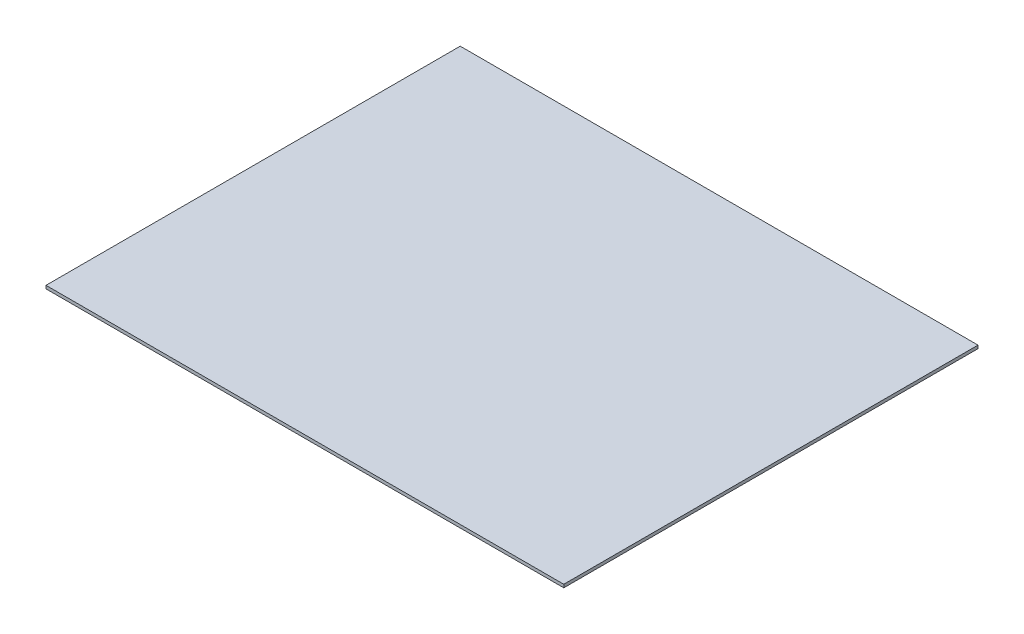
ISO-10303-21;
HEADER;
FILE_DESCRIPTION(('STEP AP214'),'2;1');
FILE_NAME('part.step','',(''),(''),'','','');
FILE_SCHEMA(('AUTOMOTIVE_DESIGN { 1 0 10303 214 1 1 1 1 }'));
ENDSEC;
DATA;
#1=APPLICATION_CONTEXT('core data for automotive mechanical design processes');
#2=APPLICATION_PROTOCOL_DEFINITION('international standard','automotive_design',2000,#1);
#3=PRODUCT_CONTEXT('',#1,'mechanical');
#4=PRODUCT('Part','Part','',(#3));
#5=PRODUCT_RELATED_PRODUCT_CATEGORY('part','',(#4));
#6=PRODUCT_DEFINITION_FORMATION('','',#4);
#7=PRODUCT_DEFINITION_CONTEXT('part definition',#1,'design');
#8=PRODUCT_DEFINITION('design','',#6,#7);
#9=PRODUCT_DEFINITION_SHAPE('','',#8);
#10=(LENGTH_UNIT() NAMED_UNIT(*) SI_UNIT(.MILLI.,.METRE.));
#11=(NAMED_UNIT(*) PLANE_ANGLE_UNIT() SI_UNIT($,.RADIAN.));
#12=(NAMED_UNIT(*) SI_UNIT($,.STERADIAN.) SOLID_ANGLE_UNIT());
#13=UNCERTAINTY_MEASURE_WITH_UNIT(LENGTH_MEASURE(1.E-05),#10,'distance_accuracy_value','');
#14=(GEOMETRIC_REPRESENTATION_CONTEXT(3) GLOBAL_UNCERTAINTY_ASSIGNED_CONTEXT((#13)) GLOBAL_UNIT_ASSIGNED_CONTEXT((#10,
#11,#12)) REPRESENTATION_CONTEXT('',''));
#15=CARTESIAN_POINT('',(0.,0.,0.));
#16=DIRECTION('',(0.,0.,1.));
#17=DIRECTION('',(1.,0.,0.));
#18=AXIS2_PLACEMENT_3D('',#15,#16,#17);
#19=CARTESIAN_POINT('',(-63.4999999999999,-196.85,-558.8));
#20=DIRECTION('',(0.,0.,1.));
#21=DIRECTION('',(1.,0.,0.));
#22=AXIS2_PLACEMENT_3D('',#19,#20,#21);
#23=PLANE('',#22);
#24=DIRECTION('',(0.,1.,0.));
#25=VECTOR('',#24,1.);
#26=CARTESIAN_POINT('',(63.5000000000001,-196.85,-558.8));
#27=LINE('',#26,#25);
#28=CARTESIAN_POINT('',(63.5000000000001,-196.85,-558.8));
#29=VERTEX_POINT('',#28);
#30=CARTESIAN_POINT('',(63.5000000000001,-196.088,-558.8));
#31=VERTEX_POINT('',#30);
#32=EDGE_CURVE('E93',#29,#31,#27,.T.);
#33=ORIENTED_EDGE('',*,*,#32,.F.);
#34=DIRECTION('',(-1.,0.,0.));
#35=VECTOR('',#34,1.);
#36=CARTESIAN_POINT('',(-69.85,-196.85,-558.8));
#37=LINE('',#36,#35);
#38=CARTESIAN_POINT('',(-63.4999999999999,-196.85,-558.8));
#39=VERTEX_POINT('',#38);
#40=EDGE_CURVE('E98',#29,#39,#37,.T.);
#41=ORIENTED_EDGE('',*,*,#40,.T.);
#42=DIRECTION('',(0.,1.,0.));
#43=VECTOR('',#42,1.);
#44=CARTESIAN_POINT('',(-63.4999999999999,-196.85,-558.8));
#45=LINE('',#44,#43);
#46=CARTESIAN_POINT('',(-63.4999999999999,-196.088,-558.8));
#47=VERTEX_POINT('',#46);
#48=EDGE_CURVE('E92',#39,#47,#45,.T.);
#49=ORIENTED_EDGE('',*,*,#48,.T.);
#50=DIRECTION('',(-1.,0.,0.));
#51=VECTOR('',#50,1.);
#52=CARTESIAN_POINT('',(-69.85,-196.088,-558.8));
#53=LINE('',#52,#51);
#54=EDGE_CURVE('E11',#31,#47,#53,.T.);
#55=ORIENTED_EDGE('',*,*,#54,.F.);
#56=EDGE_LOOP('',(#33,#41,#49,#55));
#57=FACE_BOUND('',#56,.T.);
#58=ADVANCED_FACE('F34',(#57),#23,.F.);
#59=CARTESIAN_POINT('',(63.5000000000001,-196.85,-457.2));
#60=DIRECTION('',(-1.,0.,0.));
#61=DIRECTION('',(0.,0.,1.));
#62=AXIS2_PLACEMENT_3D('',#59,#60,#61);
#63=PLANE('',#62);
#64=DIRECTION('',(0.,1.,0.));
#65=VECTOR('',#64,1.);
#66=CARTESIAN_POINT('',(63.5000000000001,-196.85,-457.2));
#67=LINE('',#66,#65);
#68=CARTESIAN_POINT('',(63.5000000000001,-196.85,-457.2));
#69=VERTEX_POINT('',#68);
#70=CARTESIAN_POINT('',(63.5000000000001,-196.088,-457.2));
#71=VERTEX_POINT('',#70);
#72=EDGE_CURVE('E38',#69,#71,#67,.T.);
#73=ORIENTED_EDGE('',*,*,#72,.F.);
#74=DIRECTION('',(0.,0.,-1.));
#75=VECTOR('',#74,1.);
#76=CARTESIAN_POINT('',(63.5000000000002,-196.85,-883.4669125955));
#77=LINE('',#76,#75);
#78=EDGE_CURVE('E102',#69,#29,#77,.T.);
#79=ORIENTED_EDGE('',*,*,#78,.T.);
#80=ORIENTED_EDGE('',*,*,#32,.T.);
#81=DIRECTION('',(0.,0.,-1.));
#82=VECTOR('',#81,1.);
#83=CARTESIAN_POINT('',(63.5000000000002,-196.088,-883.4669125955));
#84=LINE('',#83,#82);
#85=EDGE_CURVE('E86',#71,#31,#84,.T.);
#86=ORIENTED_EDGE('',*,*,#85,.F.);
#87=EDGE_LOOP('',(#73,#79,#80,#86));
#88=FACE_BOUND('',#87,.T.);
#89=ADVANCED_FACE('F107',(#88),#63,.F.);
#90=CARTESIAN_POINT('',(-63.4999999999999,-196.85,-660.4));
#91=DIRECTION('',(1.,0.,0.));
#92=DIRECTION('',(0.,0.,-1.));
#93=AXIS2_PLACEMENT_3D('',#90,#91,#92);
#94=PLANE('',#93);
#95=ORIENTED_EDGE('',*,*,#48,.F.);
#96=DIRECTION('',(0.,0.,1.));
#97=VECTOR('',#96,1.);
#98=CARTESIAN_POINT('',(-63.4999999999999,-196.85,-883.4669125955));
#99=LINE('',#98,#97);
#100=CARTESIAN_POINT('',(-63.4999999999999,-196.85,-457.2));
#101=VERTEX_POINT('',#100);
#102=EDGE_CURVE('E90',#39,#101,#99,.T.);
#103=ORIENTED_EDGE('',*,*,#102,.T.);
#104=DIRECTION('',(0.,1.,0.));
#105=VECTOR('',#104,1.);
#106=CARTESIAN_POINT('',(-63.4999999999999,-196.85,-457.2));
#107=LINE('',#106,#105);
#108=CARTESIAN_POINT('',(-63.4999999999999,-196.088,-457.2));
#109=VERTEX_POINT('',#108);
#110=EDGE_CURVE('E84',#101,#109,#107,.T.);
#111=ORIENTED_EDGE('',*,*,#110,.T.);
#112=DIRECTION('',(0.,0.,1.));
#113=VECTOR('',#112,1.);
#114=CARTESIAN_POINT('',(-63.4999999999999,-196.088,-883.4669125955));
#115=LINE('',#114,#113);
#116=EDGE_CURVE('E43',#47,#109,#115,.T.);
#117=ORIENTED_EDGE('',*,*,#116,.F.);
#118=EDGE_LOOP('',(#95,#103,#111,#117));
#119=FACE_BOUND('',#118,.T.);
#120=ADVANCED_FACE('F88',(#119),#94,.F.);
#121=CARTESIAN_POINT('',(-63.4999999999999,-196.85,-457.2));
#122=DIRECTION('',(0.,0.,-1.));
#123=DIRECTION('',(-1.,0.,0.));
#124=AXIS2_PLACEMENT_3D('',#121,#122,#123);
#125=PLANE('',#124);
#126=ORIENTED_EDGE('',*,*,#110,.F.);
#127=DIRECTION('',(1.,0.,0.));
#128=VECTOR('',#127,1.);
#129=CARTESIAN_POINT('',(-69.85,-196.85,-457.2));
#130=LINE('',#129,#128);
#131=EDGE_CURVE('E100',#101,#69,#130,.T.);
#132=ORIENTED_EDGE('',*,*,#131,.T.);
#133=ORIENTED_EDGE('',*,*,#72,.T.);
#134=DIRECTION('',(1.,0.,0.));
#135=VECTOR('',#134,1.);
#136=CARTESIAN_POINT('',(-69.85,-196.088,-457.2));
#137=LINE('',#136,#135);
#138=EDGE_CURVE('E74',#109,#71,#137,.T.);
#139=ORIENTED_EDGE('',*,*,#138,.F.);
#140=EDGE_LOOP('',(#126,#132,#133,#139));
#141=FACE_BOUND('',#140,.T.);
#142=ADVANCED_FACE('F82',(#141),#125,.F.);
#143=CARTESIAN_POINT('',(-69.85,-196.088,-883.4669125955));
#144=DIRECTION('',(0.,-1.,0.));
#145=DIRECTION('',(0.,0.,-1.));
#146=AXIS2_PLACEMENT_3D('',#143,#144,#145);
#147=PLANE('',#146);
#148=ORIENTED_EDGE('',*,*,#138,.T.);
#149=ORIENTED_EDGE('',*,*,#85,.T.);
#150=ORIENTED_EDGE('',*,*,#54,.T.);
#151=ORIENTED_EDGE('',*,*,#116,.T.);
#152=EDGE_LOOP('',(#148,#149,#150,#151));
#153=FACE_BOUND('',#152,.T.);
#154=ADVANCED_FACE('F73',(#153),#147,.F.);
#155=CARTESIAN_POINT('',(-69.85,-196.85,-883.4669125955));
#156=DIRECTION('',(0.,-1.,0.));
#157=DIRECTION('',(0.,0.,-1.));
#158=AXIS2_PLACEMENT_3D('',#155,#156,#157);
#159=PLANE('',#158);
#160=ORIENTED_EDGE('',*,*,#78,.F.);
#161=ORIENTED_EDGE('',*,*,#131,.F.);
#162=ORIENTED_EDGE('',*,*,#102,.F.);
#163=ORIENTED_EDGE('',*,*,#40,.F.);
#164=EDGE_LOOP('',(#160,#161,#162,#163));
#165=FACE_BOUND('',#164,.T.);
#166=ADVANCED_FACE('F36',(#165),#159,.T.);
#167=CLOSED_SHELL('',(#58,#89,#120,#142,#154,#166));
#168=MANIFOLD_SOLID_BREP('B2',#167);
#169=ADVANCED_BREP_SHAPE_REPRESENTATION('',(#18,#168),#14);
#170=SHAPE_DEFINITION_REPRESENTATION(#9,#169);
ENDSEC;
END-ISO-10303-21;
